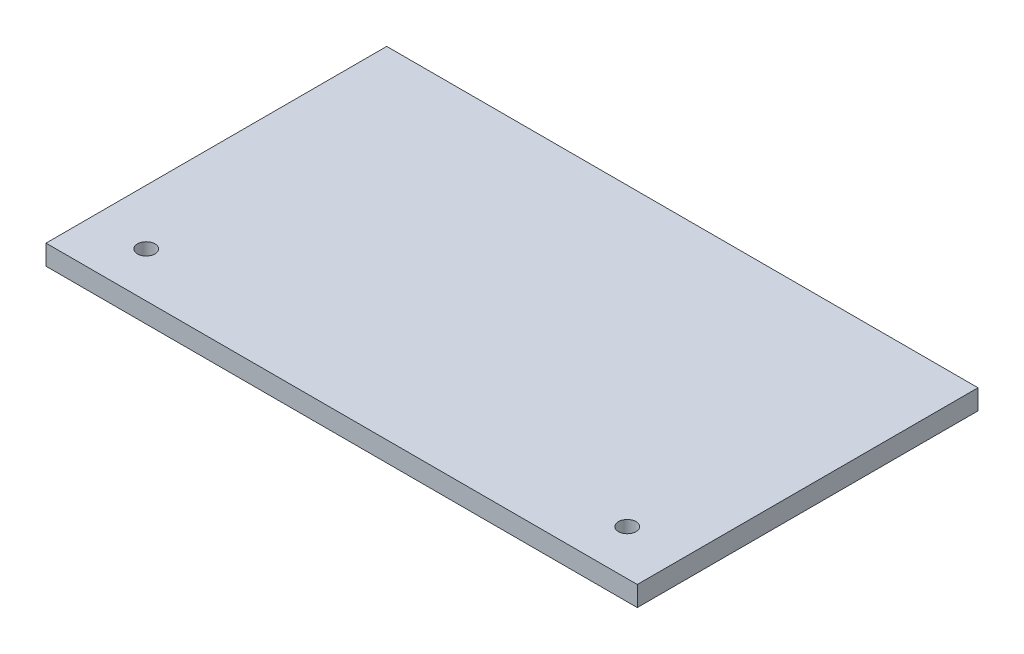
ISO-10303-21;
HEADER;
FILE_DESCRIPTION(('STEP AP214'),'2;1');
FILE_NAME('part.step','',(''),(''),'','','');
FILE_SCHEMA(('AUTOMOTIVE_DESIGN { 1 0 10303 214 1 1 1 1 }'));
ENDSEC;
DATA;
#1=APPLICATION_CONTEXT('core data for automotive mechanical design processes');
#2=APPLICATION_PROTOCOL_DEFINITION('international standard','automotive_design',2000,#1);
#3=PRODUCT_CONTEXT('',#1,'mechanical');
#4=PRODUCT('Part','Part','',(#3));
#5=PRODUCT_RELATED_PRODUCT_CATEGORY('part','',(#4));
#6=PRODUCT_DEFINITION_FORMATION('','',#4);
#7=PRODUCT_DEFINITION_CONTEXT('part definition',#1,'design');
#8=PRODUCT_DEFINITION('design','',#6,#7);
#9=PRODUCT_DEFINITION_SHAPE('','',#8);
#10=(LENGTH_UNIT() NAMED_UNIT(*) SI_UNIT(.MILLI.,.METRE.));
#11=(NAMED_UNIT(*) PLANE_ANGLE_UNIT() SI_UNIT($,.RADIAN.));
#12=(NAMED_UNIT(*) SI_UNIT($,.STERADIAN.) SOLID_ANGLE_UNIT());
#13=UNCERTAINTY_MEASURE_WITH_UNIT(LENGTH_MEASURE(1.E-05),#10,'distance_accuracy_value','');
#14=(GEOMETRIC_REPRESENTATION_CONTEXT(3) GLOBAL_UNCERTAINTY_ASSIGNED_CONTEXT((#13)) GLOBAL_UNIT_ASSIGNED_CONTEXT((#10,
#11,#12)) REPRESENTATION_CONTEXT('',''));
#15=CARTESIAN_POINT('',(0.,0.,0.));
#16=DIRECTION('',(0.,0.,1.));
#17=DIRECTION('',(1.,0.,0.));
#18=AXIS2_PLACEMENT_3D('',#15,#16,#17);
#19=CARTESIAN_POINT('',(0.,4.,0.));
#20=DIRECTION('',(0.,-1.,0.));
#21=DIRECTION('',(0.,0.,-1.));
#22=AXIS2_PLACEMENT_3D('',#19,#20,#21);
#23=PLANE('',#22);
#24=DIRECTION('',(0.,0.,1.));
#25=VECTOR('',#24,1.);
#26=CARTESIAN_POINT('',(-59.,4.,34.));
#27=LINE('',#26,#25);
#28=CARTESIAN_POINT('',(-59.,4.,-34.));
#29=VERTEX_POINT('',#28);
#30=CARTESIAN_POINT('',(-59.,4.,34.));
#31=VERTEX_POINT('',#30);
#32=EDGE_CURVE('E91',#29,#31,#27,.T.);
#33=ORIENTED_EDGE('',*,*,#32,.T.);
#34=DIRECTION('',(1.,0.,0.));
#35=VECTOR('',#34,1.);
#36=CARTESIAN_POINT('',(-59.,4.,34.));
#37=LINE('',#36,#35);
#38=CARTESIAN_POINT('',(59.,4.,34.));
#39=VERTEX_POINT('',#38);
#40=EDGE_CURVE('E86',#31,#39,#37,.T.);
#41=ORIENTED_EDGE('',*,*,#40,.T.);
#42=DIRECTION('',(0.,0.,-1.));
#43=VECTOR('',#42,1.);
#44=CARTESIAN_POINT('',(59.,4.,34.));
#45=LINE('',#44,#43);
#46=CARTESIAN_POINT('',(59.,4.,-34.));
#47=VERTEX_POINT('',#46);
#48=EDGE_CURVE('E87',#39,#47,#45,.T.);
#49=ORIENTED_EDGE('',*,*,#48,.T.);
#50=DIRECTION('',(-1.,0.,0.));
#51=VECTOR('',#50,1.);
#52=CARTESIAN_POINT('',(-59.,4.,-34.));
#53=LINE('',#52,#51);
#54=EDGE_CURVE('E57',#47,#29,#53,.T.);
#55=ORIENTED_EDGE('',*,*,#54,.T.);
#56=EDGE_LOOP('',(#33,#41,#49,#55));
#57=FACE_BOUND('',#56,.T.);
#58=CARTESIAN_POINT('',(-48.,4.,25.));
#59=DIRECTION('',(0.,1.,0.));
#60=DIRECTION('',(0.,0.,1.));
#61=AXIS2_PLACEMENT_3D('',#58,#59,#60);
#62=CIRCLE('',#61,1.75);
#63=CARTESIAN_POINT('',(-48.,4.,26.75));
#64=VERTEX_POINT('',#63);
#65=EDGE_CURVE('E106',#64,#64,#62,.T.);
#66=ORIENTED_EDGE('',*,*,#65,.F.);
#67=EDGE_LOOP('',(#66));
#68=FACE_BOUND('',#67,.T.);
#69=CARTESIAN_POINT('',(48.,4.,25.));
#70=DIRECTION('',(0.,1.,0.));
#71=DIRECTION('',(0.,0.,1.));
#72=AXIS2_PLACEMENT_3D('',#69,#70,#71);
#73=CIRCLE('',#72,1.75);
#74=CARTESIAN_POINT('',(48.,4.,26.75));
#75=VERTEX_POINT('',#74);
#76=EDGE_CURVE('E123',#75,#75,#73,.T.);
#77=ORIENTED_EDGE('',*,*,#76,.F.);
#78=EDGE_LOOP('',(#77));
#79=FACE_BOUND('',#78,.T.);
#80=ADVANCED_FACE('F39',(#57,#68,#79),#23,.F.);
#81=CARTESIAN_POINT('',(0.,0.,0.));
#82=DIRECTION('',(0.,-1.,0.));
#83=DIRECTION('',(0.,0.,-1.));
#84=AXIS2_PLACEMENT_3D('',#81,#82,#83);
#85=PLANE('',#84);
#86=CARTESIAN_POINT('',(-48.,0.,25.));
#87=DIRECTION('',(0.,1.,0.));
#88=DIRECTION('',(0.,0.,1.));
#89=AXIS2_PLACEMENT_3D('',#86,#87,#88);
#90=CIRCLE('',#89,1.75);
#91=CARTESIAN_POINT('',(-48.,0.,26.75));
#92=VERTEX_POINT('',#91);
#93=EDGE_CURVE('E119',#92,#92,#90,.T.);
#94=ORIENTED_EDGE('',*,*,#93,.T.);
#95=EDGE_LOOP('',(#94));
#96=FACE_BOUND('',#95,.T.);
#97=DIRECTION('',(0.,0.,1.));
#98=VECTOR('',#97,1.);
#99=CARTESIAN_POINT('',(-59.,0.,34.));
#100=LINE('',#99,#98);
#101=CARTESIAN_POINT('',(-59.,0.,-34.));
#102=VERTEX_POINT('',#101);
#103=CARTESIAN_POINT('',(-59.,0.,34.));
#104=VERTEX_POINT('',#103);
#105=EDGE_CURVE('E104',#102,#104,#100,.T.);
#106=ORIENTED_EDGE('',*,*,#105,.F.);
#107=DIRECTION('',(-1.,0.,0.));
#108=VECTOR('',#107,1.);
#109=CARTESIAN_POINT('',(-59.,0.,-34.));
#110=LINE('',#109,#108);
#111=CARTESIAN_POINT('',(59.,0.,-34.));
#112=VERTEX_POINT('',#111);
#113=EDGE_CURVE('E80',#112,#102,#110,.T.);
#114=ORIENTED_EDGE('',*,*,#113,.F.);
#115=DIRECTION('',(0.,0.,-1.));
#116=VECTOR('',#115,1.);
#117=CARTESIAN_POINT('',(59.,0.,34.));
#118=LINE('',#117,#116);
#119=CARTESIAN_POINT('',(59.,0.,34.));
#120=VERTEX_POINT('',#119);
#121=EDGE_CURVE('E74',#120,#112,#118,.T.);
#122=ORIENTED_EDGE('',*,*,#121,.F.);
#123=DIRECTION('',(1.,0.,0.));
#124=VECTOR('',#123,1.);
#125=CARTESIAN_POINT('',(-59.,0.,34.));
#126=LINE('',#125,#124);
#127=EDGE_CURVE('E94',#104,#120,#126,.T.);
#128=ORIENTED_EDGE('',*,*,#127,.F.);
#129=EDGE_LOOP('',(#106,#114,#122,#128));
#130=FACE_BOUND('',#129,.T.);
#131=CARTESIAN_POINT('',(48.,0.,25.));
#132=DIRECTION('',(0.,1.,0.));
#133=DIRECTION('',(0.,0.,1.));
#134=AXIS2_PLACEMENT_3D('',#131,#132,#133);
#135=CIRCLE('',#134,1.75);
#136=CARTESIAN_POINT('',(48.,0.,26.75));
#137=VERTEX_POINT('',#136);
#138=EDGE_CURVE('E125',#137,#137,#135,.T.);
#139=ORIENTED_EDGE('',*,*,#138,.T.);
#140=EDGE_LOOP('',(#139));
#141=FACE_BOUND('',#140,.T.);
#142=ADVANCED_FACE('F114',(#96,#130,#141),#85,.T.);
#143=CARTESIAN_POINT('',(-59.,4.,34.));
#144=DIRECTION('',(1.,0.,0.));
#145=DIRECTION('',(0.,0.,-1.));
#146=AXIS2_PLACEMENT_3D('',#143,#144,#145);
#147=PLANE('',#146);
#148=ORIENTED_EDGE('',*,*,#105,.T.);
#149=DIRECTION('',(0.,-1.,0.));
#150=VECTOR('',#149,1.);
#151=CARTESIAN_POINT('',(-59.,4.,34.));
#152=LINE('',#151,#150);
#153=EDGE_CURVE('E11',#31,#104,#152,.T.);
#154=ORIENTED_EDGE('',*,*,#153,.F.);
#155=ORIENTED_EDGE('',*,*,#32,.F.);
#156=DIRECTION('',(0.,-1.,0.));
#157=VECTOR('',#156,1.);
#158=CARTESIAN_POINT('',(-59.,4.,-34.));
#159=LINE('',#158,#157);
#160=EDGE_CURVE('E98',#29,#102,#159,.T.);
#161=ORIENTED_EDGE('',*,*,#160,.T.);
#162=EDGE_LOOP('',(#148,#154,#155,#161));
#163=FACE_BOUND('',#162,.T.);
#164=ADVANCED_FACE('F41',(#163),#147,.F.);
#165=CARTESIAN_POINT('',(-59.,4.,34.));
#166=DIRECTION('',(0.,0.,-1.));
#167=DIRECTION('',(-1.,0.,0.));
#168=AXIS2_PLACEMENT_3D('',#165,#166,#167);
#169=PLANE('',#168);
#170=ORIENTED_EDGE('',*,*,#127,.T.);
#171=DIRECTION('',(0.,-1.,0.));
#172=VECTOR('',#171,1.);
#173=CARTESIAN_POINT('',(59.,4.,34.));
#174=LINE('',#173,#172);
#175=EDGE_CURVE('E48',#39,#120,#174,.T.);
#176=ORIENTED_EDGE('',*,*,#175,.F.);
#177=ORIENTED_EDGE('',*,*,#40,.F.);
#178=ORIENTED_EDGE('',*,*,#153,.T.);
#179=EDGE_LOOP('',(#170,#176,#177,#178));
#180=FACE_BOUND('',#179,.T.);
#181=ADVANCED_FACE('F92',(#180),#169,.F.);
#182=CARTESIAN_POINT('',(59.,4.,34.));
#183=DIRECTION('',(-1.,0.,0.));
#184=DIRECTION('',(0.,0.,1.));
#185=AXIS2_PLACEMENT_3D('',#182,#183,#184);
#186=PLANE('',#185);
#187=ORIENTED_EDGE('',*,*,#121,.T.);
#188=DIRECTION('',(0.,-1.,0.));
#189=VECTOR('',#188,1.);
#190=CARTESIAN_POINT('',(59.,4.,-34.));
#191=LINE('',#190,#189);
#192=EDGE_CURVE('E96',#47,#112,#191,.T.);
#193=ORIENTED_EDGE('',*,*,#192,.F.);
#194=ORIENTED_EDGE('',*,*,#48,.F.);
#195=ORIENTED_EDGE('',*,*,#175,.T.);
#196=EDGE_LOOP('',(#187,#193,#194,#195));
#197=FACE_BOUND('',#196,.T.);
#198=ADVANCED_FACE('F100',(#197),#186,.F.);
#199=CARTESIAN_POINT('',(-59.,4.,-34.));
#200=DIRECTION('',(0.,0.,1.));
#201=DIRECTION('',(1.,0.,0.));
#202=AXIS2_PLACEMENT_3D('',#199,#200,#201);
#203=PLANE('',#202);
#204=ORIENTED_EDGE('',*,*,#113,.T.);
#205=ORIENTED_EDGE('',*,*,#160,.F.);
#206=ORIENTED_EDGE('',*,*,#54,.F.);
#207=ORIENTED_EDGE('',*,*,#192,.T.);
#208=EDGE_LOOP('',(#204,#205,#206,#207));
#209=FACE_BOUND('',#208,.T.);
#210=ADVANCED_FACE('F112',(#209),#203,.F.);
#211=CARTESIAN_POINT('',(-48.,4.,25.));
#212=DIRECTION('',(0.,-1.,0.));
#213=DIRECTION('',(0.,0.,-1.));
#214=AXIS2_PLACEMENT_3D('',#211,#212,#213);
#215=CYLINDRICAL_SURFACE('',#214,1.75);
#216=ORIENTED_EDGE('',*,*,#65,.T.);
#217=EDGE_LOOP('',(#216));
#218=FACE_BOUND('',#217,.T.);
#219=ORIENTED_EDGE('',*,*,#93,.F.);
#220=EDGE_LOOP('',(#219));
#221=FACE_BOUND('',#220,.T.);
#222=ADVANCED_FACE('F141',(#218,#221),#215,.F.);
#223=CARTESIAN_POINT('',(48.,4.,25.));
#224=DIRECTION('',(0.,-1.,0.));
#225=DIRECTION('',(0.,0.,-1.));
#226=AXIS2_PLACEMENT_3D('',#223,#224,#225);
#227=CYLINDRICAL_SURFACE('',#226,1.75);
#228=ORIENTED_EDGE('',*,*,#76,.T.);
#229=EDGE_LOOP('',(#228));
#230=FACE_BOUND('',#229,.T.);
#231=ORIENTED_EDGE('',*,*,#138,.F.);
#232=EDGE_LOOP('',(#231));
#233=FACE_BOUND('',#232,.T.);
#234=ADVANCED_FACE('F127',(#230,#233),#227,.F.);
#235=CLOSED_SHELL('',(#80,#142,#164,#181,#198,#210,#222,#234));
#236=MANIFOLD_SOLID_BREP('B2',#235);
#237=ADVANCED_BREP_SHAPE_REPRESENTATION('',(#18,#236),#14);
#238=SHAPE_DEFINITION_REPRESENTATION(#9,#237);
ENDSEC;
END-ISO-10303-21;
